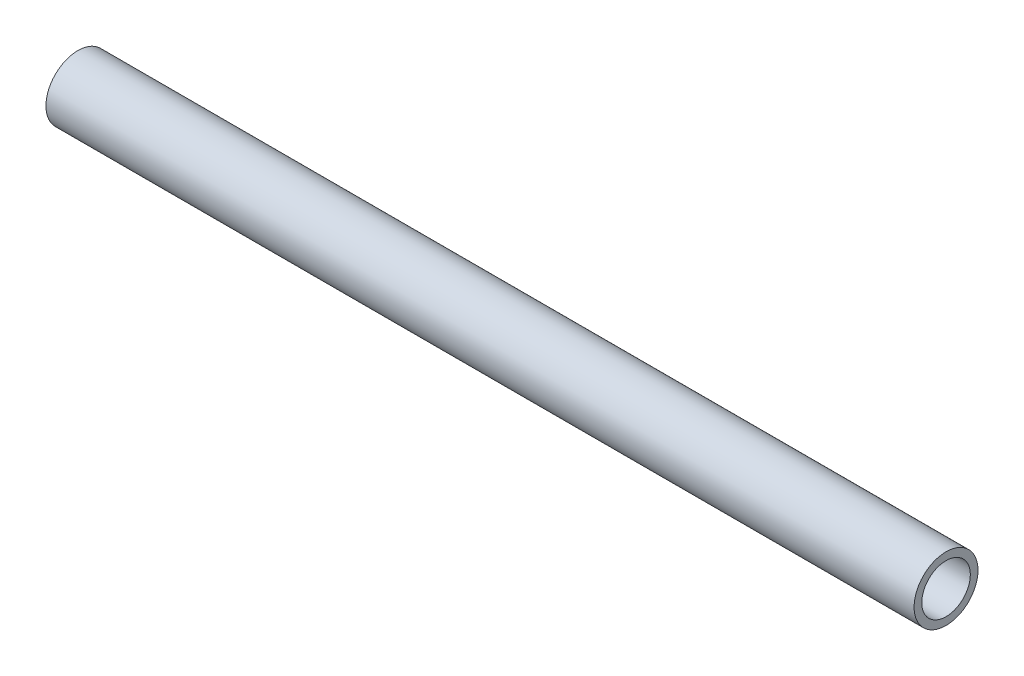
ISO-10303-21;
HEADER;
FILE_DESCRIPTION(('STEP AP214'),'2;1');
FILE_NAME('part.step','',(''),(''),'','','');
FILE_SCHEMA(('AUTOMOTIVE_DESIGN { 1 0 10303 214 1 1 1 1 }'));
ENDSEC;
DATA;
#1=APPLICATION_CONTEXT('core data for automotive mechanical design processes');
#2=APPLICATION_PROTOCOL_DEFINITION('international standard','automotive_design',2000,#1);
#3=PRODUCT_CONTEXT('',#1,'mechanical');
#4=PRODUCT('Part','Part','',(#3));
#5=PRODUCT_RELATED_PRODUCT_CATEGORY('part','',(#4));
#6=PRODUCT_DEFINITION_FORMATION('','',#4);
#7=PRODUCT_DEFINITION_CONTEXT('part definition',#1,'design');
#8=PRODUCT_DEFINITION('design','',#6,#7);
#9=PRODUCT_DEFINITION_SHAPE('','',#8);
#10=(LENGTH_UNIT() NAMED_UNIT(*) SI_UNIT(.MILLI.,.METRE.));
#11=(NAMED_UNIT(*) PLANE_ANGLE_UNIT() SI_UNIT($,.RADIAN.));
#12=(NAMED_UNIT(*) SI_UNIT($,.STERADIAN.) SOLID_ANGLE_UNIT());
#13=UNCERTAINTY_MEASURE_WITH_UNIT(LENGTH_MEASURE(1.E-05),#10,'distance_accuracy_value','');
#14=(GEOMETRIC_REPRESENTATION_CONTEXT(3) GLOBAL_UNCERTAINTY_ASSIGNED_CONTEXT((#13)) GLOBAL_UNIT_ASSIGNED_CONTEXT((#10,
#11,#12)) REPRESENTATION_CONTEXT('',''));
#15=CARTESIAN_POINT('',(0.,0.,0.));
#16=DIRECTION('',(0.,0.,1.));
#17=DIRECTION('',(1.,0.,0.));
#18=AXIS2_PLACEMENT_3D('',#15,#16,#17);
#19=CARTESIAN_POINT('',(345.,0.,0.));
#20=DIRECTION('',(1.,0.,0.));
#21=DIRECTION('',(0.,0.,-1.));
#22=AXIS2_PLACEMENT_3D('',#19,#20,#21);
#23=PLANE('',#22);
#24=CARTESIAN_POINT('',(345.,0.,0.));
#25=DIRECTION('',(1.,0.,0.));
#26=DIRECTION('',(0.,0.,-1.));
#27=AXIS2_PLACEMENT_3D('',#24,#25,#26);
#28=CIRCLE('',#27,12.7);
#29=CARTESIAN_POINT('',(345.,0.,-12.7));
#30=VERTEX_POINT('',#29);
#31=EDGE_CURVE('E10',#30,#30,#28,.T.);
#32=ORIENTED_EDGE('',*,*,#31,.T.);
#33=EDGE_LOOP('',(#32));
#34=FACE_BOUND('',#33,.T.);
#35=CARTESIAN_POINT('',(345.,0.,0.));
#36=DIRECTION('',(1.,0.,0.));
#37=DIRECTION('',(0.,0.,-1.));
#38=AXIS2_PLACEMENT_3D('',#35,#36,#37);
#39=CIRCLE('',#38,9.652);
#40=CARTESIAN_POINT('',(345.,0.,-9.652));
#41=VERTEX_POINT('',#40);
#42=EDGE_CURVE('E45',#41,#41,#39,.T.);
#43=ORIENTED_EDGE('',*,*,#42,.F.);
#44=EDGE_LOOP('',(#43));
#45=FACE_BOUND('',#44,.T.);
#46=ADVANCED_FACE('F34',(#34,#45),#23,.T.);
#47=CARTESIAN_POINT('',(0.,0.,0.));
#48=DIRECTION('',(1.,0.,0.));
#49=DIRECTION('',(0.,0.,-1.));
#50=AXIS2_PLACEMENT_3D('',#47,#48,#49);
#51=PLANE('',#50);
#52=CARTESIAN_POINT('',(0.,0.,0.));
#53=DIRECTION('',(1.,0.,0.));
#54=DIRECTION('',(0.,0.,-1.));
#55=AXIS2_PLACEMENT_3D('',#52,#53,#54);
#56=CIRCLE('',#55,12.7);
#57=CARTESIAN_POINT('',(0.,0.,-12.7));
#58=VERTEX_POINT('',#57);
#59=EDGE_CURVE('E38',#58,#58,#56,.T.);
#60=ORIENTED_EDGE('',*,*,#59,.F.);
#61=EDGE_LOOP('',(#60));
#62=FACE_BOUND('',#61,.T.);
#63=CARTESIAN_POINT('',(0.,0.,0.));
#64=DIRECTION('',(1.,0.,0.));
#65=DIRECTION('',(0.,0.,-1.));
#66=AXIS2_PLACEMENT_3D('',#63,#64,#65);
#67=CIRCLE('',#66,9.652);
#68=CARTESIAN_POINT('',(0.,0.,-9.652));
#69=VERTEX_POINT('',#68);
#70=EDGE_CURVE('E47',#69,#69,#67,.T.);
#71=ORIENTED_EDGE('',*,*,#70,.T.);
#72=EDGE_LOOP('',(#71));
#73=FACE_BOUND('',#72,.T.);
#74=ADVANCED_FACE('F57',(#62,#73),#51,.F.);
#75=CARTESIAN_POINT('',(345.,0.,0.));
#76=DIRECTION('',(-1.,0.,0.));
#77=DIRECTION('',(0.,0.,1.));
#78=AXIS2_PLACEMENT_3D('',#75,#76,#77);
#79=CYLINDRICAL_SURFACE('',#78,12.7);
#80=ORIENTED_EDGE('',*,*,#31,.F.);
#81=EDGE_LOOP('',(#80));
#82=FACE_BOUND('',#81,.T.);
#83=ORIENTED_EDGE('',*,*,#59,.T.);
#84=EDGE_LOOP('',(#83));
#85=FACE_BOUND('',#84,.T.);
#86=ADVANCED_FACE('F36',(#82,#85),#79,.T.);
#87=CARTESIAN_POINT('',(345.,0.,0.));
#88=DIRECTION('',(-1.,0.,0.));
#89=DIRECTION('',(0.,0.,1.));
#90=AXIS2_PLACEMENT_3D('',#87,#88,#89);
#91=CYLINDRICAL_SURFACE('',#90,9.652);
#92=ORIENTED_EDGE('',*,*,#42,.T.);
#93=EDGE_LOOP('',(#92));
#94=FACE_BOUND('',#93,.T.);
#95=ORIENTED_EDGE('',*,*,#70,.F.);
#96=EDGE_LOOP('',(#95));
#97=FACE_BOUND('',#96,.T.);
#98=ADVANCED_FACE('F53',(#94,#97),#91,.F.);
#99=CLOSED_SHELL('',(#46,#74,#86,#98));
#100=MANIFOLD_SOLID_BREP('B2',#99);
#101=ADVANCED_BREP_SHAPE_REPRESENTATION('',(#18,#100),#14);
#102=SHAPE_DEFINITION_REPRESENTATION(#9,#101);
ENDSEC;
END-ISO-10303-21;
